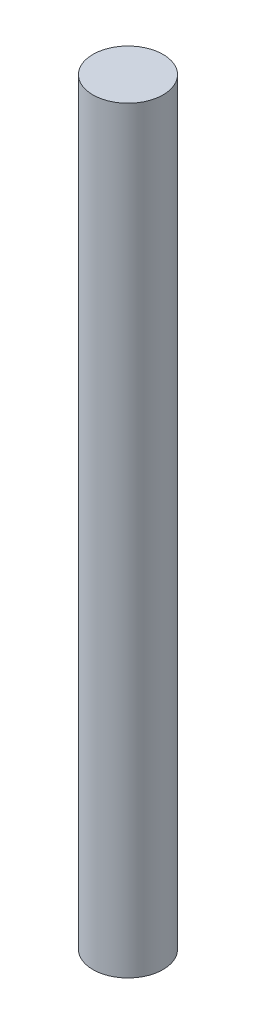
ISO-10303-21;
HEADER;
FILE_DESCRIPTION(('STEP AP214'),'2;1');
FILE_NAME('part.step','',(''),(''),'','','');
FILE_SCHEMA(('AUTOMOTIVE_DESIGN { 1 0 10303 214 1 1 1 1 }'));
ENDSEC;
DATA;
#1=APPLICATION_CONTEXT('core data for automotive mechanical design processes');
#2=APPLICATION_PROTOCOL_DEFINITION('international standard','automotive_design',2000,#1);
#3=PRODUCT_CONTEXT('',#1,'mechanical');
#4=PRODUCT('Part','Part','',(#3));
#5=PRODUCT_RELATED_PRODUCT_CATEGORY('part','',(#4));
#6=PRODUCT_DEFINITION_FORMATION('','',#4);
#7=PRODUCT_DEFINITION_CONTEXT('part definition',#1,'design');
#8=PRODUCT_DEFINITION('design','',#6,#7);
#9=PRODUCT_DEFINITION_SHAPE('','',#8);
#10=(LENGTH_UNIT() NAMED_UNIT(*) SI_UNIT(.MILLI.,.METRE.));
#11=(NAMED_UNIT(*) PLANE_ANGLE_UNIT() SI_UNIT($,.RADIAN.));
#12=(NAMED_UNIT(*) SI_UNIT($,.STERADIAN.) SOLID_ANGLE_UNIT());
#13=UNCERTAINTY_MEASURE_WITH_UNIT(LENGTH_MEASURE(1.E-05),#10,'distance_accuracy_value','');
#14=(GEOMETRIC_REPRESENTATION_CONTEXT(3) GLOBAL_UNCERTAINTY_ASSIGNED_CONTEXT((#13)) GLOBAL_UNIT_ASSIGNED_CONTEXT((#10,
#11,#12)) REPRESENTATION_CONTEXT('',''));
#15=CARTESIAN_POINT('',(0.,0.,0.));
#16=DIRECTION('',(0.,0.,1.));
#17=DIRECTION('',(1.,0.,0.));
#18=AXIS2_PLACEMENT_3D('',#15,#16,#17);
#19=CARTESIAN_POINT('',(0.,68.58,0.));
#20=DIRECTION('',(0.,-1.,0.));
#21=DIRECTION('',(0.,0.,-1.));
#22=AXIS2_PLACEMENT_3D('',#19,#20,#21);
#23=CYLINDRICAL_SURFACE('',#22,3.175);
#24=CARTESIAN_POINT('',(0.,68.58,0.));
#25=DIRECTION('',(0.,1.,0.));
#26=DIRECTION('',(0.,0.,1.));
#27=AXIS2_PLACEMENT_3D('',#24,#25,#26);
#28=CIRCLE('',#27,3.175);
#29=CARTESIAN_POINT('',(0.,68.58,3.175));
#30=VERTEX_POINT('',#29);
#31=EDGE_CURVE('E10',#30,#30,#28,.T.);
#32=ORIENTED_EDGE('',*,*,#31,.F.);
#33=EDGE_LOOP('',(#32));
#34=FACE_BOUND('',#33,.T.);
#35=CARTESIAN_POINT('',(0.,0.,0.));
#36=DIRECTION('',(0.,1.,0.));
#37=DIRECTION('',(0.,0.,1.));
#38=AXIS2_PLACEMENT_3D('',#35,#36,#37);
#39=CIRCLE('',#38,3.175);
#40=CARTESIAN_POINT('',(0.,0.,3.175));
#41=VERTEX_POINT('',#40);
#42=EDGE_CURVE('E37',#41,#41,#39,.T.);
#43=ORIENTED_EDGE('',*,*,#42,.T.);
#44=EDGE_LOOP('',(#43));
#45=FACE_BOUND('',#44,.T.);
#46=ADVANCED_FACE('F34',(#34,#45),#23,.T.);
#47=CARTESIAN_POINT('',(0.,68.58,0.));
#48=DIRECTION('',(0.,1.,0.));
#49=DIRECTION('',(0.,0.,1.));
#50=AXIS2_PLACEMENT_3D('',#47,#48,#49);
#51=PLANE('',#50);
#52=ORIENTED_EDGE('',*,*,#31,.T.);
#53=EDGE_LOOP('',(#52));
#54=FACE_BOUND('',#53,.T.);
#55=ADVANCED_FACE('F49',(#54),#51,.T.);
#56=CARTESIAN_POINT('',(0.,0.,0.));
#57=DIRECTION('',(0.,1.,0.));
#58=DIRECTION('',(0.,0.,1.));
#59=AXIS2_PLACEMENT_3D('',#56,#57,#58);
#60=PLANE('',#59);
#61=ORIENTED_EDGE('',*,*,#42,.F.);
#62=EDGE_LOOP('',(#61));
#63=FACE_BOUND('',#62,.T.);
#64=ADVANCED_FACE('F47',(#63),#60,.F.);
#65=CLOSED_SHELL('',(#46,#55,#64));
#66=MANIFOLD_SOLID_BREP('B2',#65);
#67=ADVANCED_BREP_SHAPE_REPRESENTATION('',(#18,#66),#14);
#68=SHAPE_DEFINITION_REPRESENTATION(#9,#67);
ENDSEC;
END-ISO-10303-21;
